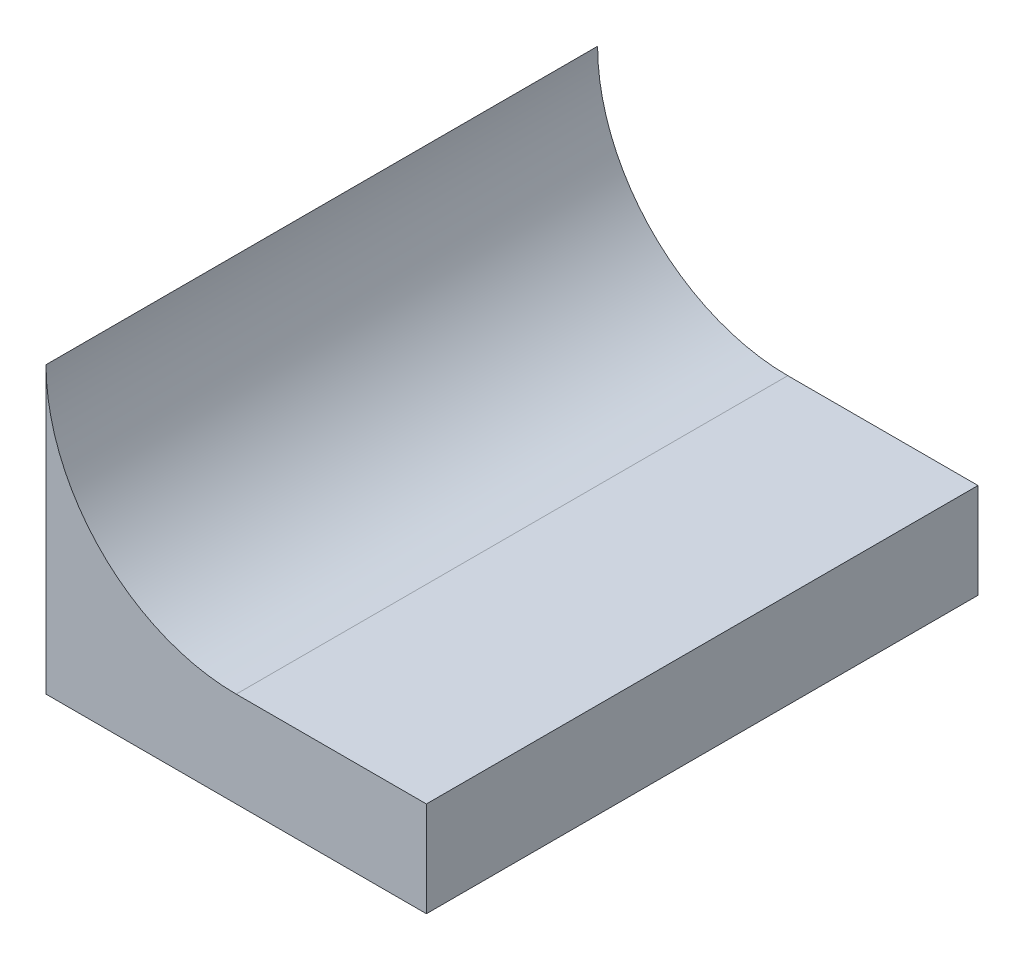
ISO-10303-21;
HEADER;
FILE_DESCRIPTION(('STEP AP214'),'2;1');
FILE_NAME('part.step','',(''),(''),'','','');
FILE_SCHEMA(('AUTOMOTIVE_DESIGN { 1 0 10303 214 1 1 1 1 }'));
ENDSEC;
DATA;
#1=APPLICATION_CONTEXT('core data for automotive mechanical design processes');
#2=APPLICATION_PROTOCOL_DEFINITION('international standard','automotive_design',2000,#1);
#3=PRODUCT_CONTEXT('',#1,'mechanical');
#4=PRODUCT('Part','Part','',(#3));
#5=PRODUCT_RELATED_PRODUCT_CATEGORY('part','',(#4));
#6=PRODUCT_DEFINITION_FORMATION('','',#4);
#7=PRODUCT_DEFINITION_CONTEXT('part definition',#1,'design');
#8=PRODUCT_DEFINITION('design','',#6,#7);
#9=PRODUCT_DEFINITION_SHAPE('','',#8);
#10=(LENGTH_UNIT() NAMED_UNIT(*) SI_UNIT(.MILLI.,.METRE.));
#11=(NAMED_UNIT(*) PLANE_ANGLE_UNIT() SI_UNIT($,.RADIAN.));
#12=(NAMED_UNIT(*) SI_UNIT($,.STERADIAN.) SOLID_ANGLE_UNIT());
#13=UNCERTAINTY_MEASURE_WITH_UNIT(LENGTH_MEASURE(1.E-05),#10,'distance_accuracy_value','');
#14=(GEOMETRIC_REPRESENTATION_CONTEXT(3) GLOBAL_UNCERTAINTY_ASSIGNED_CONTEXT((#13)) GLOBAL_UNIT_ASSIGNED_CONTEXT((#10,
#11,#12)) REPRESENTATION_CONTEXT('',''));
#15=CARTESIAN_POINT('',(0.,0.,0.));
#16=DIRECTION('',(0.,0.,1.));
#17=DIRECTION('',(1.,0.,0.));
#18=AXIS2_PLACEMENT_3D('',#15,#16,#17);
#19=CARTESIAN_POINT('',(0.,0.3,0.29));
#20=DIRECTION('',(1.,0.,0.));
#21=DIRECTION('',(0.,0.,-1.));
#22=AXIS2_PLACEMENT_3D('',#19,#20,#21);
#23=PLANE('',#22);
#24=DIRECTION('',(0.,-1.,0.));
#25=VECTOR('',#24,1.);
#26=CARTESIAN_POINT('',(0.,0.3,-0.29));
#27=LINE('',#26,#25);
#28=CARTESIAN_POINT('',(0.,0.3,-0.29));
#29=VERTEX_POINT('',#28);
#30=CARTESIAN_POINT('',(0.,0.,-0.29));
#31=VERTEX_POINT('',#30);
#32=EDGE_CURVE('E107',#29,#31,#27,.T.);
#33=ORIENTED_EDGE('',*,*,#32,.T.);
#34=DIRECTION('',(0.,0.,-1.));
#35=VECTOR('',#34,1.);
#36=CARTESIAN_POINT('',(0.,0.,0.29));
#37=LINE('',#36,#35);
#38=CARTESIAN_POINT('',(0.,0.,0.29));
#39=VERTEX_POINT('',#38);
#40=EDGE_CURVE('E11',#39,#31,#37,.T.);
#41=ORIENTED_EDGE('',*,*,#40,.F.);
#42=DIRECTION('',(0.,-1.,0.));
#43=VECTOR('',#42,1.);
#44=CARTESIAN_POINT('',(0.,0.3,0.29));
#45=LINE('',#44,#43);
#46=CARTESIAN_POINT('',(0.,0.3,0.29));
#47=VERTEX_POINT('',#46);
#48=EDGE_CURVE('E115',#47,#39,#45,.T.);
#49=ORIENTED_EDGE('',*,*,#48,.F.);
#50=DIRECTION('',(0.,0.,-1.));
#51=VECTOR('',#50,1.);
#52=CARTESIAN_POINT('',(0.,0.3,0.29));
#53=LINE('',#52,#51);
#54=EDGE_CURVE('E103',#47,#29,#53,.T.);
#55=ORIENTED_EDGE('',*,*,#54,.T.);
#56=EDGE_LOOP('',(#33,#41,#49,#55));
#57=FACE_BOUND('',#56,.T.);
#58=ADVANCED_FACE('F33',(#57),#23,.F.);
#59=CARTESIAN_POINT('',(0.,0.,0.29));
#60=DIRECTION('',(0.,1.,0.));
#61=DIRECTION('',(0.,0.,1.));
#62=AXIS2_PLACEMENT_3D('',#59,#60,#61);
#63=PLANE('',#62);
#64=DIRECTION('',(1.,0.,0.));
#65=VECTOR('',#64,1.);
#66=CARTESIAN_POINT('',(0.,0.,-0.29));
#67=LINE('',#66,#65);
#68=CARTESIAN_POINT('',(0.4,0.,-0.29));
#69=VERTEX_POINT('',#68);
#70=EDGE_CURVE('E110',#31,#69,#67,.T.);
#71=ORIENTED_EDGE('',*,*,#70,.T.);
#72=DIRECTION('',(0.,0.,-1.));
#73=VECTOR('',#72,1.);
#74=CARTESIAN_POINT('',(0.4,0.,0.29));
#75=LINE('',#74,#73);
#76=CARTESIAN_POINT('',(0.4,0.,0.29));
#77=VERTEX_POINT('',#76);
#78=EDGE_CURVE('E41',#77,#69,#75,.T.);
#79=ORIENTED_EDGE('',*,*,#78,.F.);
#80=DIRECTION('',(1.,0.,0.));
#81=VECTOR('',#80,1.);
#82=CARTESIAN_POINT('',(0.,0.,0.29));
#83=LINE('',#82,#81);
#84=EDGE_CURVE('E83',#39,#77,#83,.T.);
#85=ORIENTED_EDGE('',*,*,#84,.F.);
#86=ORIENTED_EDGE('',*,*,#40,.T.);
#87=EDGE_LOOP('',(#71,#79,#85,#86));
#88=FACE_BOUND('',#87,.T.);
#89=ADVANCED_FACE('F134',(#88),#63,.F.);
#90=CARTESIAN_POINT('',(0.4,0.,0.29));
#91=DIRECTION('',(-1.,0.,0.));
#92=DIRECTION('',(0.,0.,1.));
#93=AXIS2_PLACEMENT_3D('',#90,#91,#92);
#94=PLANE('',#93);
#95=DIRECTION('',(0.,1.,0.));
#96=VECTOR('',#95,1.);
#97=CARTESIAN_POINT('',(0.4,0.,-0.29));
#98=LINE('',#97,#96);
#99=CARTESIAN_POINT('',(0.4,0.1,-0.29));
#100=VERTEX_POINT('',#99);
#101=EDGE_CURVE('E98',#69,#100,#98,.T.);
#102=ORIENTED_EDGE('',*,*,#101,.T.);
#103=DIRECTION('',(0.,0.,-1.));
#104=VECTOR('',#103,1.);
#105=CARTESIAN_POINT('',(0.4,0.1,0.29));
#106=LINE('',#105,#104);
#107=CARTESIAN_POINT('',(0.4,0.1,0.29));
#108=VERTEX_POINT('',#107);
#109=EDGE_CURVE('E95',#108,#100,#106,.T.);
#110=ORIENTED_EDGE('',*,*,#109,.F.);
#111=DIRECTION('',(0.,1.,0.));
#112=VECTOR('',#111,1.);
#113=CARTESIAN_POINT('',(0.4,0.,0.29));
#114=LINE('',#113,#112);
#115=EDGE_CURVE('E87',#77,#108,#114,.T.);
#116=ORIENTED_EDGE('',*,*,#115,.F.);
#117=ORIENTED_EDGE('',*,*,#78,.T.);
#118=EDGE_LOOP('',(#102,#110,#116,#117));
#119=FACE_BOUND('',#118,.T.);
#120=ADVANCED_FACE('F96',(#119),#94,.F.);
#121=CARTESIAN_POINT('',(0.4,0.1,0.29));
#122=DIRECTION('',(0.,-1.,0.));
#123=DIRECTION('',(1.,0.,0.));
#124=AXIS2_PLACEMENT_3D('',#121,#122,#123);
#125=PLANE('',#124);
#126=DIRECTION('',(-1.,0.,0.));
#127=VECTOR('',#126,1.);
#128=CARTESIAN_POINT('',(0.4,0.1,-0.29));
#129=LINE('',#128,#127);
#130=CARTESIAN_POINT('',(0.2,0.0999999999999999,-0.29));
#131=VERTEX_POINT('',#130);
#132=EDGE_CURVE('E69',#100,#131,#129,.T.);
#133=ORIENTED_EDGE('',*,*,#132,.T.);
#134=DIRECTION('',(0.,0.,-1.));
#135=VECTOR('',#134,1.);
#136=CARTESIAN_POINT('',(0.2,0.0999999999999999,0.29));
#137=LINE('',#136,#135);
#138=CARTESIAN_POINT('',(0.2,0.0999999999999999,0.29));
#139=VERTEX_POINT('',#138);
#140=EDGE_CURVE('E99',#139,#131,#137,.T.);
#141=ORIENTED_EDGE('',*,*,#140,.F.);
#142=DIRECTION('',(-1.,0.,0.));
#143=VECTOR('',#142,1.);
#144=CARTESIAN_POINT('',(0.4,0.1,0.29));
#145=LINE('',#144,#143);
#146=EDGE_CURVE('E91',#108,#139,#145,.T.);
#147=ORIENTED_EDGE('',*,*,#146,.F.);
#148=ORIENTED_EDGE('',*,*,#109,.T.);
#149=EDGE_LOOP('',(#133,#141,#147,#148));
#150=FACE_BOUND('',#149,.T.);
#151=ADVANCED_FACE('F101',(#150),#125,.F.);
#152=CARTESIAN_POINT('',(0.2,0.3,0.29));
#153=DIRECTION('',(0.,0.,-1.));
#154=DIRECTION('',(-1.,0.,0.));
#155=AXIS2_PLACEMENT_3D('',#152,#153,#154);
#156=CYLINDRICAL_SURFACE('',#155,0.2);
#157=CARTESIAN_POINT('',(0.2,0.3,-0.29));
#158=DIRECTION('',(0.,0.,-1.));
#159=DIRECTION('',(1.,0.,0.));
#160=AXIS2_PLACEMENT_3D('',#157,#158,#159);
#161=CIRCLE('',#160,0.2);
#162=EDGE_CURVE('E75',#131,#29,#161,.T.);
#163=ORIENTED_EDGE('',*,*,#162,.T.);
#164=ORIENTED_EDGE('',*,*,#54,.F.);
#165=CARTESIAN_POINT('',(0.2,0.3,0.29));
#166=DIRECTION('',(0.,0.,-1.));
#167=DIRECTION('',(1.,0.,0.));
#168=AXIS2_PLACEMENT_3D('',#165,#166,#167);
#169=CIRCLE('',#168,0.2);
#170=EDGE_CURVE('E49',#139,#47,#169,.T.);
#171=ORIENTED_EDGE('',*,*,#170,.F.);
#172=ORIENTED_EDGE('',*,*,#140,.T.);
#173=EDGE_LOOP('',(#163,#164,#171,#172));
#174=FACE_BOUND('',#173,.T.);
#175=ADVANCED_FACE('F123',(#174),#156,.F.);
#176=CARTESIAN_POINT('',(0.2,0.3,0.29));
#177=DIRECTION('',(0.,0.,1.));
#178=DIRECTION('',(1.,0.,0.));
#179=AXIS2_PLACEMENT_3D('',#176,#177,#178);
#180=PLANE('',#179);
#181=ORIENTED_EDGE('',*,*,#48,.T.);
#182=ORIENTED_EDGE('',*,*,#84,.T.);
#183=ORIENTED_EDGE('',*,*,#115,.T.);
#184=ORIENTED_EDGE('',*,*,#146,.T.);
#185=ORIENTED_EDGE('',*,*,#170,.T.);
#186=EDGE_LOOP('',(#181,#182,#183,#184,#185));
#187=FACE_BOUND('',#186,.T.);
#188=ADVANCED_FACE('F89',(#187),#180,.T.);
#189=CARTESIAN_POINT('',(0.2,0.3,-0.29));
#190=DIRECTION('',(0.,0.,1.));
#191=DIRECTION('',(1.,0.,0.));
#192=AXIS2_PLACEMENT_3D('',#189,#190,#191);
#193=PLANE('',#192);
#194=ORIENTED_EDGE('',*,*,#32,.F.);
#195=ORIENTED_EDGE('',*,*,#162,.F.);
#196=ORIENTED_EDGE('',*,*,#132,.F.);
#197=ORIENTED_EDGE('',*,*,#101,.F.);
#198=ORIENTED_EDGE('',*,*,#70,.F.);
#199=EDGE_LOOP('',(#194,#195,#196,#197,#198));
#200=FACE_BOUND('',#199,.T.);
#201=ADVANCED_FACE('F119',(#200),#193,.F.);
#202=CLOSED_SHELL('',(#58,#89,#120,#151,#175,#188,#201));
#203=MANIFOLD_SOLID_BREP('B2',#202);
#204=ADVANCED_BREP_SHAPE_REPRESENTATION('',(#18,#203),#14);
#205=SHAPE_DEFINITION_REPRESENTATION(#9,#204);
ENDSEC;
END-ISO-10303-21;
